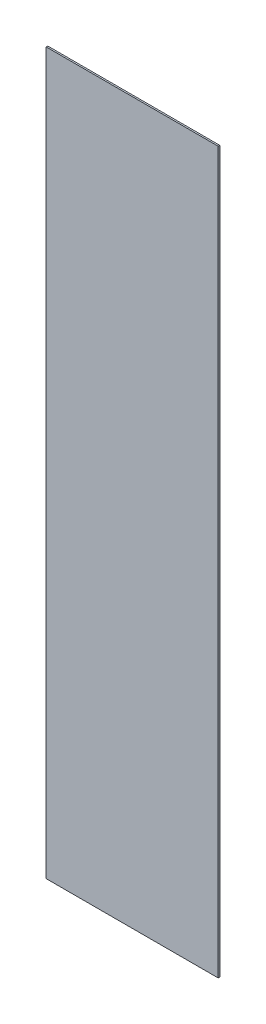
ISO-10303-21;
HEADER;
FILE_DESCRIPTION(('STEP AP214'),'2;1');
FILE_NAME('part.step','',(''),(''),'','','');
FILE_SCHEMA(('AUTOMOTIVE_DESIGN { 1 0 10303 214 1 1 1 1 }'));
ENDSEC;
DATA;
#1=APPLICATION_CONTEXT('core data for automotive mechanical design processes');
#2=APPLICATION_PROTOCOL_DEFINITION('international standard','automotive_design',2000,#1);
#3=PRODUCT_CONTEXT('',#1,'mechanical');
#4=PRODUCT('Part','Part','',(#3));
#5=PRODUCT_RELATED_PRODUCT_CATEGORY('part','',(#4));
#6=PRODUCT_DEFINITION_FORMATION('','',#4);
#7=PRODUCT_DEFINITION_CONTEXT('part definition',#1,'design');
#8=PRODUCT_DEFINITION('design','',#6,#7);
#9=PRODUCT_DEFINITION_SHAPE('','',#8);
#10=(LENGTH_UNIT() NAMED_UNIT(*) SI_UNIT(.MILLI.,.METRE.));
#11=(NAMED_UNIT(*) PLANE_ANGLE_UNIT() SI_UNIT($,.RADIAN.));
#12=(NAMED_UNIT(*) SI_UNIT($,.STERADIAN.) SOLID_ANGLE_UNIT());
#13=UNCERTAINTY_MEASURE_WITH_UNIT(LENGTH_MEASURE(1.E-05),#10,'distance_accuracy_value','');
#14=(GEOMETRIC_REPRESENTATION_CONTEXT(3) GLOBAL_UNCERTAINTY_ASSIGNED_CONTEXT((#13)) GLOBAL_UNIT_ASSIGNED_CONTEXT((#10,
#11,#12)) REPRESENTATION_CONTEXT('',''));
#15=CARTESIAN_POINT('',(0.,0.,0.));
#16=DIRECTION('',(0.,0.,1.));
#17=DIRECTION('',(1.,0.,0.));
#18=AXIS2_PLACEMENT_3D('',#15,#16,#17);
#19=CARTESIAN_POINT('',(150.4,629.75,2.75));
#20=DIRECTION('',(-1.,0.,0.));
#21=DIRECTION('',(0.,-1.,0.));
#22=AXIS2_PLACEMENT_3D('',#19,#20,#21);
#23=PLANE('',#22);
#24=DIRECTION('',(0.,1.,0.));
#25=VECTOR('',#24,1.);
#26=CARTESIAN_POINT('',(150.4,629.75,0.));
#27=LINE('',#26,#25);
#28=CARTESIAN_POINT('',(150.4,-629.75,0.));
#29=VERTEX_POINT('',#28);
#30=CARTESIAN_POINT('',(150.4,629.75,0.));
#31=VERTEX_POINT('',#30);
#32=EDGE_CURVE('E98',#29,#31,#27,.T.);
#33=ORIENTED_EDGE('',*,*,#32,.T.);
#34=DIRECTION('',(0.,0.,-1.));
#35=VECTOR('',#34,1.);
#36=CARTESIAN_POINT('',(150.4,629.75,2.75));
#37=LINE('',#36,#35);
#38=CARTESIAN_POINT('',(150.4,629.75,2.75));
#39=VERTEX_POINT('',#38);
#40=EDGE_CURVE('E11',#39,#31,#37,.T.);
#41=ORIENTED_EDGE('',*,*,#40,.F.);
#42=DIRECTION('',(0.,1.,0.));
#43=VECTOR('',#42,1.);
#44=CARTESIAN_POINT('',(150.4,629.75,2.75));
#45=LINE('',#44,#43);
#46=CARTESIAN_POINT('',(150.4,-629.75,2.75));
#47=VERTEX_POINT('',#46);
#48=EDGE_CURVE('E86',#47,#39,#45,.T.);
#49=ORIENTED_EDGE('',*,*,#48,.F.);
#50=DIRECTION('',(0.,0.,-1.));
#51=VECTOR('',#50,1.);
#52=CARTESIAN_POINT('',(150.4,-629.75,2.75));
#53=LINE('',#52,#51);
#54=EDGE_CURVE('E94',#47,#29,#53,.T.);
#55=ORIENTED_EDGE('',*,*,#54,.T.);
#56=EDGE_LOOP('',(#33,#41,#49,#55));
#57=FACE_BOUND('',#56,.T.);
#58=ADVANCED_FACE('F35',(#57),#23,.F.);
#59=CARTESIAN_POINT('',(-150.4,629.75,2.75));
#60=DIRECTION('',(0.,-1.,0.));
#61=DIRECTION('',(0.,0.,-1.));
#62=AXIS2_PLACEMENT_3D('',#59,#60,#61);
#63=PLANE('',#62);
#64=DIRECTION('',(-1.,0.,0.));
#65=VECTOR('',#64,1.);
#66=CARTESIAN_POINT('',(-150.4,629.75,0.));
#67=LINE('',#66,#65);
#68=CARTESIAN_POINT('',(-150.4,629.75,0.));
#69=VERTEX_POINT('',#68);
#70=EDGE_CURVE('E90',#31,#69,#67,.T.);
#71=ORIENTED_EDGE('',*,*,#70,.T.);
#72=DIRECTION('',(0.,0.,-1.));
#73=VECTOR('',#72,1.);
#74=CARTESIAN_POINT('',(-150.4,629.75,2.75));
#75=LINE('',#74,#73);
#76=CARTESIAN_POINT('',(-150.4,629.75,2.75));
#77=VERTEX_POINT('',#76);
#78=EDGE_CURVE('E43',#77,#69,#75,.T.);
#79=ORIENTED_EDGE('',*,*,#78,.F.);
#80=DIRECTION('',(-1.,0.,0.));
#81=VECTOR('',#80,1.);
#82=CARTESIAN_POINT('',(-150.4,629.75,2.75));
#83=LINE('',#82,#81);
#84=EDGE_CURVE('E81',#39,#77,#83,.T.);
#85=ORIENTED_EDGE('',*,*,#84,.F.);
#86=ORIENTED_EDGE('',*,*,#40,.T.);
#87=EDGE_LOOP('',(#71,#79,#85,#86));
#88=FACE_BOUND('',#87,.T.);
#89=ADVANCED_FACE('F89',(#88),#63,.F.);
#90=CARTESIAN_POINT('',(-150.4,629.75,2.75));
#91=DIRECTION('',(1.,0.,0.));
#92=DIRECTION('',(0.,1.,0.));
#93=AXIS2_PLACEMENT_3D('',#90,#91,#92);
#94=PLANE('',#93);
#95=DIRECTION('',(0.,-1.,0.));
#96=VECTOR('',#95,1.);
#97=CARTESIAN_POINT('',(-150.4,629.75,0.));
#98=LINE('',#97,#96);
#99=CARTESIAN_POINT('',(-150.4,-629.75,0.));
#100=VERTEX_POINT('',#99);
#101=EDGE_CURVE('E68',#69,#100,#98,.T.);
#102=ORIENTED_EDGE('',*,*,#101,.T.);
#103=DIRECTION('',(0.,0.,-1.));
#104=VECTOR('',#103,1.);
#105=CARTESIAN_POINT('',(-150.4,-629.75,2.75));
#106=LINE('',#105,#104);
#107=CARTESIAN_POINT('',(-150.4,-629.75,2.75));
#108=VERTEX_POINT('',#107);
#109=EDGE_CURVE('E91',#108,#100,#106,.T.);
#110=ORIENTED_EDGE('',*,*,#109,.F.);
#111=DIRECTION('',(0.,-1.,0.));
#112=VECTOR('',#111,1.);
#113=CARTESIAN_POINT('',(-150.4,629.75,2.75));
#114=LINE('',#113,#112);
#115=EDGE_CURVE('E84',#77,#108,#114,.T.);
#116=ORIENTED_EDGE('',*,*,#115,.F.);
#117=ORIENTED_EDGE('',*,*,#78,.T.);
#118=EDGE_LOOP('',(#102,#110,#116,#117));
#119=FACE_BOUND('',#118,.T.);
#120=ADVANCED_FACE('F92',(#119),#94,.F.);
#121=CARTESIAN_POINT('',(-150.4,-629.75,2.75));
#122=DIRECTION('',(0.,1.,0.));
#123=DIRECTION('',(0.,0.,1.));
#124=AXIS2_PLACEMENT_3D('',#121,#122,#123);
#125=PLANE('',#124);
#126=DIRECTION('',(1.,0.,0.));
#127=VECTOR('',#126,1.);
#128=CARTESIAN_POINT('',(-150.4,-629.75,0.));
#129=LINE('',#128,#127);
#130=EDGE_CURVE('E74',#100,#29,#129,.T.);
#131=ORIENTED_EDGE('',*,*,#130,.T.);
#132=ORIENTED_EDGE('',*,*,#54,.F.);
#133=DIRECTION('',(1.,0.,0.));
#134=VECTOR('',#133,1.);
#135=CARTESIAN_POINT('',(-150.4,-629.75,2.75));
#136=LINE('',#135,#134);
#137=EDGE_CURVE('E51',#108,#47,#136,.T.);
#138=ORIENTED_EDGE('',*,*,#137,.F.);
#139=ORIENTED_EDGE('',*,*,#109,.T.);
#140=EDGE_LOOP('',(#131,#132,#138,#139));
#141=FACE_BOUND('',#140,.T.);
#142=ADVANCED_FACE('F105',(#141),#125,.F.);
#143=CARTESIAN_POINT('',(0.,0.,2.75));
#144=DIRECTION('',(0.,0.,1.));
#145=DIRECTION('',(1.,0.,0.));
#146=AXIS2_PLACEMENT_3D('',#143,#144,#145);
#147=PLANE('',#146);
#148=ORIENTED_EDGE('',*,*,#48,.T.);
#149=ORIENTED_EDGE('',*,*,#84,.T.);
#150=ORIENTED_EDGE('',*,*,#115,.T.);
#151=ORIENTED_EDGE('',*,*,#137,.T.);
#152=EDGE_LOOP('',(#148,#149,#150,#151));
#153=FACE_BOUND('',#152,.T.);
#154=ADVANCED_FACE('F82',(#153),#147,.T.);
#155=CARTESIAN_POINT('',(0.,0.,0.));
#156=DIRECTION('',(0.,0.,1.));
#157=DIRECTION('',(1.,0.,0.));
#158=AXIS2_PLACEMENT_3D('',#155,#156,#157);
#159=PLANE('',#158);
#160=ORIENTED_EDGE('',*,*,#32,.F.);
#161=ORIENTED_EDGE('',*,*,#130,.F.);
#162=ORIENTED_EDGE('',*,*,#101,.F.);
#163=ORIENTED_EDGE('',*,*,#70,.F.);
#164=EDGE_LOOP('',(#160,#161,#162,#163));
#165=FACE_BOUND('',#164,.T.);
#166=ADVANCED_FACE('F108',(#165),#159,.F.);
#167=CLOSED_SHELL('',(#58,#89,#120,#142,#154,#166));
#168=MANIFOLD_SOLID_BREP('B2',#167);
#169=ADVANCED_BREP_SHAPE_REPRESENTATION('',(#18,#168),#14);
#170=SHAPE_DEFINITION_REPRESENTATION(#9,#169);
ENDSEC;
END-ISO-10303-21;
